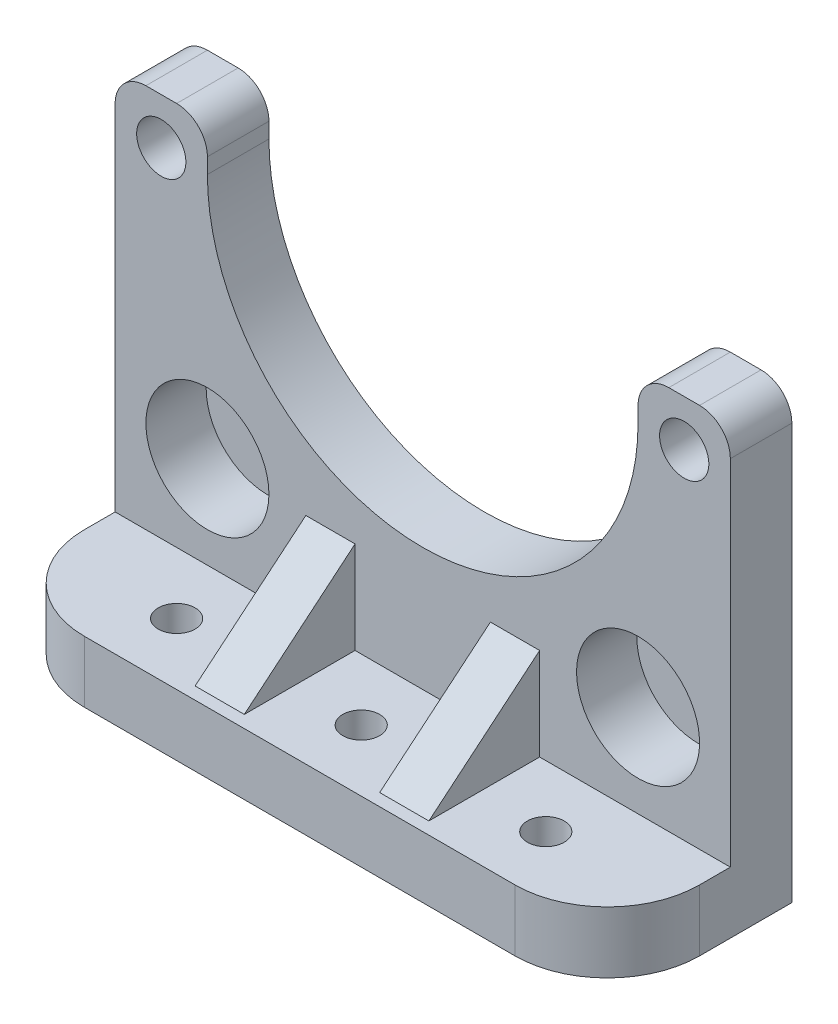
ISO-10303-21;
HEADER;
FILE_DESCRIPTION(('STEP AP214'),'2;1');
FILE_NAME('part.step','',(''),(''),'','','');
FILE_SCHEMA(('AUTOMOTIVE_DESIGN { 1 0 10303 214 1 1 1 1 }'));
ENDSEC;
DATA;
#1=APPLICATION_CONTEXT('core data for automotive mechanical design processes');
#2=APPLICATION_PROTOCOL_DEFINITION('international standard','automotive_design',2000,#1);
#3=PRODUCT_CONTEXT('',#1,'mechanical');
#4=PRODUCT('Part','Part','',(#3));
#5=PRODUCT_RELATED_PRODUCT_CATEGORY('part','',(#4));
#6=PRODUCT_DEFINITION_FORMATION('','',#4);
#7=PRODUCT_DEFINITION_CONTEXT('part definition',#1,'design');
#8=PRODUCT_DEFINITION('design','',#6,#7);
#9=PRODUCT_DEFINITION_SHAPE('','',#8);
#10=(LENGTH_UNIT() NAMED_UNIT(*) SI_UNIT(.MILLI.,.METRE.));
#11=(NAMED_UNIT(*) PLANE_ANGLE_UNIT() SI_UNIT($,.RADIAN.));
#12=(NAMED_UNIT(*) SI_UNIT($,.STERADIAN.) SOLID_ANGLE_UNIT());
#13=UNCERTAINTY_MEASURE_WITH_UNIT(LENGTH_MEASURE(1.E-05),#10,'distance_accuracy_value','');
#14=(GEOMETRIC_REPRESENTATION_CONTEXT(3) GLOBAL_UNCERTAINTY_ASSIGNED_CONTEXT((#13)) GLOBAL_UNIT_ASSIGNED_CONTEXT((#10,
#11,#12)) REPRESENTATION_CONTEXT('',''));
#15=CARTESIAN_POINT('',(0.,0.,0.));
#16=DIRECTION('',(0.,0.,1.));
#17=DIRECTION('',(1.,0.,0.));
#18=AXIS2_PLACEMENT_3D('',#15,#16,#17);
#19=CARTESIAN_POINT('',(0.,0.,10.));
#20=DIRECTION('',(0.,0.,-1.));
#21=DIRECTION('',(-1.,0.,0.));
#22=AXIS2_PLACEMENT_3D('',#19,#20,#21);
#23=PLANE('',#22);
#24=CARTESIAN_POINT('',(85.,25.,10.));
#25=DIRECTION('',(0.,0.,1.));
#26=DIRECTION('',(-1.,0.,0.));
#27=AXIS2_PLACEMENT_3D('',#24,#25,#26);
#28=CIRCLE('',#27,10.);
#29=CARTESIAN_POINT('',(75.,25.,10.));
#30=VERTEX_POINT('',#29);
#31=EDGE_CURVE('E535',#30,#30,#28,.T.);
#32=ORIENTED_EDGE('',*,*,#31,.F.);
#33=EDGE_LOOP('',(#32));
#34=FACE_BOUND('',#33,.T.);
#35=CARTESIAN_POINT('',(15.,25.,10.));
#36=DIRECTION('',(0.,0.,1.));
#37=DIRECTION('',(1.,0.,0.));
#38=AXIS2_PLACEMENT_3D('',#35,#36,#37);
#39=CIRCLE('',#38,10.);
#40=CARTESIAN_POINT('',(25.,25.,10.));
#41=VERTEX_POINT('',#40);
#42=EDGE_CURVE('E539',#41,#41,#39,.T.);
#43=ORIENTED_EDGE('',*,*,#42,.F.);
#44=EDGE_LOOP('',(#43));
#45=FACE_BOUND('',#44,.T.);
#46=CARTESIAN_POINT('',(92.5,65.,10.));
#47=DIRECTION('',(0.,0.,1.));
#48=DIRECTION('',(-1.,0.,0.));
#49=AXIS2_PLACEMENT_3D('',#46,#47,#48);
#50=CIRCLE('',#49,4.00000000000002);
#51=CARTESIAN_POINT('',(88.5,65.,10.));
#52=VERTEX_POINT('',#51);
#53=EDGE_CURVE('E548',#52,#52,#50,.T.);
#54=ORIENTED_EDGE('',*,*,#53,.F.);
#55=EDGE_LOOP('',(#54));
#56=FACE_BOUND('',#55,.T.);
#57=CARTESIAN_POINT('',(7.49999999999997,65.,10.));
#58=DIRECTION('',(0.,0.,1.));
#59=DIRECTION('',(1.,0.,0.));
#60=AXIS2_PLACEMENT_3D('',#57,#58,#59);
#61=CIRCLE('',#60,4.);
#62=CARTESIAN_POINT('',(11.5,65.,10.));
#63=VERTEX_POINT('',#62);
#64=EDGE_CURVE('E554',#63,#63,#61,.T.);
#65=ORIENTED_EDGE('',*,*,#64,.F.);
#66=EDGE_LOOP('',(#65));
#67=FACE_BOUND('',#66,.T.);
#68=DIRECTION('',(-1.,0.,0.));
#69=VECTOR('',#68,1.);
#70=CARTESIAN_POINT('',(0.,72.5,10.));
#71=LINE('',#70,#69);
#72=CARTESIAN_POINT('',(9.99999999999998,72.5,10.));
#73=VERTEX_POINT('',#72);
#74=CARTESIAN_POINT('',(4.99999999999997,72.5,10.));
#75=VERTEX_POINT('',#74);
#76=EDGE_CURVE('E282',#73,#75,#71,.T.);
#77=ORIENTED_EDGE('',*,*,#76,.T.);
#78=CARTESIAN_POINT('',(4.99999999999997,67.5,10.));
#79=DIRECTION('',(0.,0.,-1.));
#80=DIRECTION('',(-1.,0.,0.));
#81=AXIS2_PLACEMENT_3D('',#78,#79,#80);
#82=CIRCLE('',#81,5.);
#83=CARTESIAN_POINT('',(0.,67.5,10.));
#84=VERTEX_POINT('',#83);
#85=EDGE_CURVE('E423',#75,#84,#82,.F.);
#86=ORIENTED_EDGE('',*,*,#85,.T.);
#87=DIRECTION('',(0.,-1.,0.));
#88=VECTOR('',#87,1.);
#89=CARTESIAN_POINT('',(0.,0.,10.));
#90=LINE('',#89,#88);
#91=CARTESIAN_POINT('',(0.,10.,10.));
#92=VERTEX_POINT('',#91);
#93=EDGE_CURVE('E264',#84,#92,#90,.T.);
#94=ORIENTED_EDGE('',*,*,#93,.T.);
#95=DIRECTION('',(-1.,0.,0.));
#96=VECTOR('',#95,1.);
#97=CARTESIAN_POINT('',(0.,10.,10.));
#98=LINE('',#97,#96);
#99=CARTESIAN_POINT('',(31.,10.,10.));
#100=VERTEX_POINT('',#99);
#101=EDGE_CURVE('E209',#100,#92,#98,.T.);
#102=ORIENTED_EDGE('',*,*,#101,.F.);
#103=DIRECTION('',(0.,-1.,0.));
#104=VECTOR('',#103,1.);
#105=CARTESIAN_POINT('',(31.,10.,10.));
#106=LINE('',#105,#104);
#107=CARTESIAN_POINT('',(31.,25.,10.));
#108=VERTEX_POINT('',#107);
#109=EDGE_CURVE('E200',#108,#100,#106,.T.);
#110=ORIENTED_EDGE('',*,*,#109,.F.);
#111=DIRECTION('',(-1.,0.,0.));
#112=VECTOR('',#111,1.);
#113=CARTESIAN_POINT('',(31.,25.,10.));
#114=LINE('',#113,#112);
#115=CARTESIAN_POINT('',(39.,25.,10.));
#116=VERTEX_POINT('',#115);
#117=EDGE_CURVE('E182',#116,#108,#114,.T.);
#118=ORIENTED_EDGE('',*,*,#117,.F.);
#119=DIRECTION('',(0.,1.,0.));
#120=VECTOR('',#119,1.);
#121=CARTESIAN_POINT('',(39.,10.,10.));
#122=LINE('',#121,#120);
#123=CARTESIAN_POINT('',(39.,10.,10.));
#124=VERTEX_POINT('',#123);
#125=EDGE_CURVE('E194',#124,#116,#122,.T.);
#126=ORIENTED_EDGE('',*,*,#125,.F.);
#127=CARTESIAN_POINT('',(61.,10.,10.));
#128=VERTEX_POINT('',#127);
#129=EDGE_CURVE('E261',#128,#124,#98,.T.);
#130=ORIENTED_EDGE('',*,*,#129,.F.);
#131=DIRECTION('',(0.,-1.,0.));
#132=VECTOR('',#131,1.);
#133=CARTESIAN_POINT('',(61.,10.,10.));
#134=LINE('',#133,#132);
#135=CARTESIAN_POINT('',(61.,25.,10.));
#136=VERTEX_POINT('',#135);
#137=EDGE_CURVE('E570',#136,#128,#134,.T.);
#138=ORIENTED_EDGE('',*,*,#137,.F.);
#139=DIRECTION('',(-1.,0.,0.));
#140=VECTOR('',#139,1.);
#141=CARTESIAN_POINT('',(69.,25.,10.));
#142=LINE('',#141,#140);
#143=CARTESIAN_POINT('',(69.,25.,10.));
#144=VERTEX_POINT('',#143);
#145=EDGE_CURVE('E568',#144,#136,#142,.T.);
#146=ORIENTED_EDGE('',*,*,#145,.F.);
#147=DIRECTION('',(0.,1.,0.));
#148=VECTOR('',#147,1.);
#149=CARTESIAN_POINT('',(69.,10.,10.));
#150=LINE('',#149,#148);
#151=CARTESIAN_POINT('',(69.,10.,10.));
#152=VERTEX_POINT('',#151);
#153=EDGE_CURVE('E564',#152,#144,#150,.T.);
#154=ORIENTED_EDGE('',*,*,#153,.F.);
#155=CARTESIAN_POINT('',(100.,10.,10.));
#156=VERTEX_POINT('',#155);
#157=EDGE_CURVE('E245',#156,#152,#98,.T.);
#158=ORIENTED_EDGE('',*,*,#157,.F.);
#159=DIRECTION('',(0.,1.,0.));
#160=VECTOR('',#159,1.);
#161=CARTESIAN_POINT('',(100.,0.,10.));
#162=LINE('',#161,#160);
#163=CARTESIAN_POINT('',(100.,67.5,10.));
#164=VERTEX_POINT('',#163);
#165=EDGE_CURVE('E267',#156,#164,#162,.T.);
#166=ORIENTED_EDGE('',*,*,#165,.T.);
#167=CARTESIAN_POINT('',(95.,67.5,10.));
#168=DIRECTION('',(0.,0.,-1.));
#169=DIRECTION('',(-1.,0.,0.));
#170=AXIS2_PLACEMENT_3D('',#167,#168,#169);
#171=CIRCLE('',#170,5.);
#172=CARTESIAN_POINT('',(95.,72.5,10.));
#173=VERTEX_POINT('',#172);
#174=EDGE_CURVE('E412',#164,#173,#171,.F.);
#175=ORIENTED_EDGE('',*,*,#174,.T.);
#176=CARTESIAN_POINT('',(90.,72.5,10.));
#177=VERTEX_POINT('',#176);
#178=EDGE_CURVE('E278',#173,#177,#71,.T.);
#179=ORIENTED_EDGE('',*,*,#178,.T.);
#180=CARTESIAN_POINT('',(90.,67.5,10.));
#181=DIRECTION('',(0.,0.,-1.));
#182=DIRECTION('',(-1.,0.,0.));
#183=AXIS2_PLACEMENT_3D('',#180,#181,#182);
#184=CIRCLE('',#183,5.);
#185=CARTESIAN_POINT('',(85.,67.5,10.));
#186=VERTEX_POINT('',#185);
#187=EDGE_CURVE('E427',#177,#186,#184,.F.);
#188=ORIENTED_EDGE('',*,*,#187,.T.);
#189=DIRECTION('',(0.,1.,0.));
#190=VECTOR('',#189,1.);
#191=CARTESIAN_POINT('',(85.,65.,10.));
#192=LINE('',#191,#190);
#193=CARTESIAN_POINT('',(85.,65.,10.));
#194=VERTEX_POINT('',#193);
#195=EDGE_CURVE('E319',#194,#186,#192,.T.);
#196=ORIENTED_EDGE('',*,*,#195,.F.);
#197=CARTESIAN_POINT('',(50.,65.,10.));
#198=DIRECTION('',(0.,0.,1.));
#199=DIRECTION('',(1.,0.,0.));
#200=AXIS2_PLACEMENT_3D('',#197,#198,#199);
#201=CIRCLE('',#200,35.);
#202=CARTESIAN_POINT('',(15.,65.,10.));
#203=VERTEX_POINT('',#202);
#204=EDGE_CURVE('E324',#203,#194,#201,.T.);
#205=ORIENTED_EDGE('',*,*,#204,.F.);
#206=DIRECTION('',(0.,-1.,0.));
#207=VECTOR('',#206,1.);
#208=CARTESIAN_POINT('',(15.,65.,10.));
#209=LINE('',#208,#207);
#210=CARTESIAN_POINT('',(15.,67.5,10.));
#211=VERTEX_POINT('',#210);
#212=EDGE_CURVE('E251',#211,#203,#209,.T.);
#213=ORIENTED_EDGE('',*,*,#212,.F.);
#214=CARTESIAN_POINT('',(9.99999999999998,67.5,9.99999999999999));
#215=DIRECTION('',(0.,0.,-1.));
#216=DIRECTION('',(-1.,0.,0.));
#217=AXIS2_PLACEMENT_3D('',#214,#215,#216);
#218=CIRCLE('',#217,5.);
#219=EDGE_CURVE('E425',#211,#73,#218,.F.);
#220=ORIENTED_EDGE('',*,*,#219,.T.);
#221=EDGE_LOOP('',(#77,#86,#94,#102,#110,#118,#126,#130,#138,#146,#154,#158,#166,#175,#179,#188,
#196,#205,#213,#220));
#222=FACE_BOUND('',#221,.T.);
#223=ADVANCED_FACE('F34',(#34,#45,#56,#67,#222),#23,.F.);
#224=CARTESIAN_POINT('',(0.,10.,30.));
#225=DIRECTION('',(0.,-1.,0.));
#226=DIRECTION('',(0.,0.,-1.));
#227=AXIS2_PLACEMENT_3D('',#224,#225,#226);
#228=PLANE('',#227);
#229=CARTESIAN_POINT('',(80.,10.,20.));
#230=DIRECTION('',(0.,-1.,0.));
#231=DIRECTION('',(0.,0.,-1.));
#232=AXIS2_PLACEMENT_3D('',#229,#230,#231);
#233=CIRCLE('',#232,2.99999999999999);
#234=CARTESIAN_POINT('',(80.,10.,17.));
#235=VERTEX_POINT('',#234);
#236=EDGE_CURVE('E232',#235,#235,#233,.F.);
#237=ORIENTED_EDGE('',*,*,#236,.F.);
#238=EDGE_LOOP('',(#237));
#239=FACE_BOUND('',#238,.T.);
#240=DIRECTION('',(0.,0.,-1.));
#241=VECTOR('',#240,1.);
#242=CARTESIAN_POINT('',(0.,10.,30.));
#243=LINE('',#242,#241);
#244=CARTESIAN_POINT('',(0.,10.,15.));
#245=VERTEX_POINT('',#244);
#246=EDGE_CURVE('E248',#245,#92,#243,.T.);
#247=ORIENTED_EDGE('',*,*,#246,.F.);
#248=CARTESIAN_POINT('',(15.,10.,15.));
#249=DIRECTION('',(0.,-1.,0.));
#250=DIRECTION('',(0.,0.,-1.));
#251=AXIS2_PLACEMENT_3D('',#248,#249,#250);
#252=CIRCLE('',#251,15.);
#253=CARTESIAN_POINT('',(15.,10.,30.));
#254=VERTEX_POINT('',#253);
#255=EDGE_CURVE('E42',#245,#254,#252,.F.);
#256=ORIENTED_EDGE('',*,*,#255,.T.);
#257=DIRECTION('',(-1.,0.,0.));
#258=VECTOR('',#257,1.);
#259=CARTESIAN_POINT('',(0.,10.,30.));
#260=LINE('',#259,#258);
#261=CARTESIAN_POINT('',(85.,10.,30.));
#262=VERTEX_POINT('',#261);
#263=EDGE_CURVE('E244',#262,#254,#260,.T.);
#264=ORIENTED_EDGE('',*,*,#263,.F.);
#265=CARTESIAN_POINT('',(85.,10.,15.));
#266=DIRECTION('',(0.,-1.,0.));
#267=DIRECTION('',(0.,0.,-1.));
#268=AXIS2_PLACEMENT_3D('',#265,#266,#267);
#269=CIRCLE('',#268,15.);
#270=CARTESIAN_POINT('',(100.,10.,15.));
#271=VERTEX_POINT('',#270);
#272=EDGE_CURVE('E49',#262,#271,#269,.F.);
#273=ORIENTED_EDGE('',*,*,#272,.T.);
#274=DIRECTION('',(0.,0.,-1.));
#275=VECTOR('',#274,1.);
#276=CARTESIAN_POINT('',(100.,10.,30.));
#277=LINE('',#276,#275);
#278=EDGE_CURVE('E327',#271,#156,#277,.T.);
#279=ORIENTED_EDGE('',*,*,#278,.T.);
#280=ORIENTED_EDGE('',*,*,#157,.T.);
#281=DIRECTION('',(0.,0.,-1.));
#282=VECTOR('',#281,1.);
#283=CARTESIAN_POINT('',(69.,10.,47.));
#284=LINE('',#283,#282);
#285=CARTESIAN_POINT('',(69.,10.,28.));
#286=VERTEX_POINT('',#285);
#287=EDGE_CURVE('E214',#286,#152,#284,.T.);
#288=ORIENTED_EDGE('',*,*,#287,.F.);
#289=DIRECTION('',(-1.,0.,0.));
#290=VECTOR('',#289,1.);
#291=CARTESIAN_POINT('',(69.,10.,28.));
#292=LINE('',#291,#290);
#293=CARTESIAN_POINT('',(61.,10.,28.));
#294=VERTEX_POINT('',#293);
#295=EDGE_CURVE('E210',#286,#294,#292,.T.);
#296=ORIENTED_EDGE('',*,*,#295,.T.);
#297=DIRECTION('',(0.,0.,-1.));
#298=VECTOR('',#297,1.);
#299=CARTESIAN_POINT('',(61.,10.,47.));
#300=LINE('',#299,#298);
#301=EDGE_CURVE('E573',#294,#128,#300,.T.);
#302=ORIENTED_EDGE('',*,*,#301,.T.);
#303=ORIENTED_EDGE('',*,*,#129,.T.);
#304=DIRECTION('',(0.,0.,-1.));
#305=VECTOR('',#304,1.);
#306=CARTESIAN_POINT('',(39.,10.,47.));
#307=LINE('',#306,#305);
#308=CARTESIAN_POINT('',(39.,10.,28.));
#309=VERTEX_POINT('',#308);
#310=EDGE_CURVE('E193',#309,#124,#307,.T.);
#311=ORIENTED_EDGE('',*,*,#310,.F.);
#312=DIRECTION('',(-1.,0.,0.));
#313=VECTOR('',#312,1.);
#314=CARTESIAN_POINT('',(31.,10.,28.));
#315=LINE('',#314,#313);
#316=CARTESIAN_POINT('',(31.,10.,28.));
#317=VERTEX_POINT('',#316);
#318=EDGE_CURVE('E217',#309,#317,#315,.T.);
#319=ORIENTED_EDGE('',*,*,#318,.T.);
#320=DIRECTION('',(0.,0.,-1.));
#321=VECTOR('',#320,1.);
#322=CARTESIAN_POINT('',(31.,10.,47.));
#323=LINE('',#322,#321);
#324=EDGE_CURVE('E201',#317,#100,#323,.T.);
#325=ORIENTED_EDGE('',*,*,#324,.T.);
#326=ORIENTED_EDGE('',*,*,#101,.T.);
#327=EDGE_LOOP('',(#247,#256,#264,#273,#279,#280,#288,#296,#302,#303,#311,#319,#325,#326));
#328=FACE_BOUND('',#327,.T.);
#329=CARTESIAN_POINT('',(20.,10.,20.));
#330=DIRECTION('',(0.,-1.,0.));
#331=DIRECTION('',(0.,0.,-1.));
#332=AXIS2_PLACEMENT_3D('',#329,#330,#331);
#333=CIRCLE('',#332,2.99999999999999);
#334=CARTESIAN_POINT('',(20.,10.,17.));
#335=VERTEX_POINT('',#334);
#336=EDGE_CURVE('E238',#335,#335,#333,.F.);
#337=ORIENTED_EDGE('',*,*,#336,.F.);
#338=EDGE_LOOP('',(#337));
#339=FACE_BOUND('',#338,.T.);
#340=CARTESIAN_POINT('',(50.,10.,20.));
#341=DIRECTION('',(0.,-1.,0.));
#342=DIRECTION('',(0.,0.,-1.));
#343=AXIS2_PLACEMENT_3D('',#340,#341,#342);
#344=CIRCLE('',#343,3.00000000000001);
#345=CARTESIAN_POINT('',(50.,10.,17.));
#346=VERTEX_POINT('',#345);
#347=EDGE_CURVE('E226',#346,#346,#344,.F.);
#348=ORIENTED_EDGE('',*,*,#347,.F.);
#349=EDGE_LOOP('',(#348));
#350=FACE_BOUND('',#349,.T.);
#351=ADVANCED_FACE('F337',(#239,#328,#339,#350),#228,.F.);
#352=CARTESIAN_POINT('',(0.,72.5,10.));
#353=DIRECTION('',(0.,-1.,0.));
#354=DIRECTION('',(0.,0.,-1.));
#355=AXIS2_PLACEMENT_3D('',#352,#353,#354);
#356=PLANE('',#355);
#357=DIRECTION('',(-1.,0.,0.));
#358=VECTOR('',#357,1.);
#359=CARTESIAN_POINT('',(0.,72.5,0.));
#360=LINE('',#359,#358);
#361=CARTESIAN_POINT('',(95.,72.5,0.));
#362=VERTEX_POINT('',#361);
#363=CARTESIAN_POINT('',(90.,72.5,0.));
#364=VERTEX_POINT('',#363);
#365=EDGE_CURVE('E268',#362,#364,#360,.T.);
#366=ORIENTED_EDGE('',*,*,#365,.T.);
#367=DIRECTION('',(0.,0.,1.));
#368=VECTOR('',#367,1.);
#369=CARTESIAN_POINT('',(90.,72.5,10.));
#370=LINE('',#369,#368);
#371=EDGE_CURVE('E414',#364,#177,#370,.T.);
#372=ORIENTED_EDGE('',*,*,#371,.T.);
#373=ORIENTED_EDGE('',*,*,#178,.F.);
#374=DIRECTION('',(0.,0.,-1.));
#375=VECTOR('',#374,1.);
#376=CARTESIAN_POINT('',(95.,72.5,10.));
#377=LINE('',#376,#375);
#378=EDGE_CURVE('E419',#173,#362,#377,.T.);
#379=ORIENTED_EDGE('',*,*,#378,.T.);
#380=EDGE_LOOP('',(#366,#372,#373,#379));
#381=FACE_BOUND('',#380,.T.);
#382=ADVANCED_FACE('F363',(#381),#356,.F.);
#383=CARTESIAN_POINT('',(0.,0.,10.));
#384=DIRECTION('',(1.,0.,0.));
#385=DIRECTION('',(0.,1.,0.));
#386=AXIS2_PLACEMENT_3D('',#383,#384,#385);
#387=PLANE('',#386);
#388=DIRECTION('',(0.,0.,-1.));
#389=VECTOR('',#388,1.);
#390=CARTESIAN_POINT('',(0.,0.,10.));
#391=LINE('',#390,#389);
#392=CARTESIAN_POINT('',(0.,0.,15.));
#393=VERTEX_POINT('',#392);
#394=CARTESIAN_POINT('',(0.,0.,0.));
#395=VERTEX_POINT('',#394);
#396=EDGE_CURVE('E283',#393,#395,#391,.T.);
#397=ORIENTED_EDGE('',*,*,#396,.F.);
#398=DIRECTION('',(0.,-1.,0.));
#399=VECTOR('',#398,1.);
#400=CARTESIAN_POINT('',(0.,0.,15.));
#401=LINE('',#400,#399);
#402=EDGE_CURVE('E57',#393,#245,#401,.F.);
#403=ORIENTED_EDGE('',*,*,#402,.T.);
#404=ORIENTED_EDGE('',*,*,#246,.T.);
#405=ORIENTED_EDGE('',*,*,#93,.F.);
#406=DIRECTION('',(0.,0.,-1.));
#407=VECTOR('',#406,1.);
#408=CARTESIAN_POINT('',(0.,67.5,10.));
#409=LINE('',#408,#407);
#410=CARTESIAN_POINT('',(0.,67.5,0.));
#411=VERTEX_POINT('',#410);
#412=EDGE_CURVE('E269',#84,#411,#409,.T.);
#413=ORIENTED_EDGE('',*,*,#412,.T.);
#414=DIRECTION('',(0.,-1.,0.));
#415=VECTOR('',#414,1.);
#416=CARTESIAN_POINT('',(0.,0.,0.));
#417=LINE('',#416,#415);
#418=EDGE_CURVE('E295',#411,#395,#417,.T.);
#419=ORIENTED_EDGE('',*,*,#418,.T.);
#420=EDGE_LOOP('',(#397,#403,#404,#405,#413,#419));
#421=FACE_BOUND('',#420,.T.);
#422=ADVANCED_FACE('F361',(#421),#387,.F.);
#423=CARTESIAN_POINT('',(0.,0.,10.));
#424=DIRECTION('',(0.,1.,0.));
#425=DIRECTION('',(0.,0.,1.));
#426=AXIS2_PLACEMENT_3D('',#423,#424,#425);
#427=PLANE('',#426);
#428=CARTESIAN_POINT('',(50.,0.,20.));
#429=DIRECTION('',(0.,-1.,0.));
#430=DIRECTION('',(0.,0.,-1.));
#431=AXIS2_PLACEMENT_3D('',#428,#429,#430);
#432=CIRCLE('',#431,3.00000000000001);
#433=CARTESIAN_POINT('',(50.,0.,17.));
#434=VERTEX_POINT('',#433);
#435=EDGE_CURVE('E223',#434,#434,#432,.T.);
#436=ORIENTED_EDGE('',*,*,#435,.F.);
#437=EDGE_LOOP('',(#436));
#438=FACE_BOUND('',#437,.T.);
#439=CARTESIAN_POINT('',(80.,0.,20.));
#440=DIRECTION('',(0.,-1.,0.));
#441=DIRECTION('',(0.,0.,-1.));
#442=AXIS2_PLACEMENT_3D('',#439,#440,#441);
#443=CIRCLE('',#442,2.99999999999999);
#444=CARTESIAN_POINT('',(80.,0.,17.));
#445=VERTEX_POINT('',#444);
#446=EDGE_CURVE('E229',#445,#445,#443,.T.);
#447=ORIENTED_EDGE('',*,*,#446,.F.);
#448=EDGE_LOOP('',(#447));
#449=FACE_BOUND('',#448,.T.);
#450=CARTESIAN_POINT('',(20.,0.,20.));
#451=DIRECTION('',(0.,-1.,0.));
#452=DIRECTION('',(0.,0.,-1.));
#453=AXIS2_PLACEMENT_3D('',#450,#451,#452);
#454=CIRCLE('',#453,2.99999999999999);
#455=CARTESIAN_POINT('',(20.,0.,17.));
#456=VERTEX_POINT('',#455);
#457=EDGE_CURVE('E235',#456,#456,#454,.T.);
#458=ORIENTED_EDGE('',*,*,#457,.F.);
#459=EDGE_LOOP('',(#458));
#460=FACE_BOUND('',#459,.T.);
#461=DIRECTION('',(1.,0.,0.));
#462=VECTOR('',#461,1.);
#463=CARTESIAN_POINT('',(0.,0.,30.));
#464=LINE('',#463,#462);
#465=CARTESIAN_POINT('',(15.,0.,30.));
#466=VERTEX_POINT('',#465);
#467=CARTESIAN_POINT('',(85.,0.,30.));
#468=VERTEX_POINT('',#467);
#469=EDGE_CURVE('E241',#466,#468,#464,.T.);
#470=ORIENTED_EDGE('',*,*,#469,.F.);
#471=CARTESIAN_POINT('',(15.,0.,15.));
#472=DIRECTION('',(0.,1.,0.));
#473=DIRECTION('',(0.,0.,1.));
#474=AXIS2_PLACEMENT_3D('',#471,#472,#473);
#475=CIRCLE('',#474,15.);
#476=EDGE_CURVE('E350',#466,#393,#475,.F.);
#477=ORIENTED_EDGE('',*,*,#476,.T.);
#478=ORIENTED_EDGE('',*,*,#396,.T.);
#479=DIRECTION('',(1.,0.,0.));
#480=VECTOR('',#479,1.);
#481=CARTESIAN_POINT('',(0.,0.,0.));
#482=LINE('',#481,#480);
#483=CARTESIAN_POINT('',(100.,0.,0.));
#484=VERTEX_POINT('',#483);
#485=EDGE_CURVE('E293',#395,#484,#482,.T.);
#486=ORIENTED_EDGE('',*,*,#485,.T.);
#487=DIRECTION('',(0.,0.,-1.));
#488=VECTOR('',#487,1.);
#489=CARTESIAN_POINT('',(100.,0.,10.));
#490=LINE('',#489,#488);
#491=CARTESIAN_POINT('',(100.,0.,15.));
#492=VERTEX_POINT('',#491);
#493=EDGE_CURVE('E285',#492,#484,#490,.T.);
#494=ORIENTED_EDGE('',*,*,#493,.F.);
#495=CARTESIAN_POINT('',(85.,0.,15.));
#496=DIRECTION('',(0.,1.,0.));
#497=DIRECTION('',(0.,0.,1.));
#498=AXIS2_PLACEMENT_3D('',#495,#496,#497);
#499=CIRCLE('',#498,15.);
#500=EDGE_CURVE('E351',#492,#468,#499,.F.);
#501=ORIENTED_EDGE('',*,*,#500,.T.);
#502=EDGE_LOOP('',(#470,#477,#478,#486,#494,#501));
#503=FACE_BOUND('',#502,.T.);
#504=ADVANCED_FACE('F360',(#438,#449,#460,#503),#427,.F.);
#505=CARTESIAN_POINT('',(100.,0.,10.));
#506=DIRECTION('',(-1.,0.,0.));
#507=DIRECTION('',(0.,-1.,0.));
#508=AXIS2_PLACEMENT_3D('',#505,#506,#507);
#509=PLANE('',#508);
#510=ORIENTED_EDGE('',*,*,#278,.F.);
#511=DIRECTION('',(0.,1.,0.));
#512=VECTOR('',#511,1.);
#513=CARTESIAN_POINT('',(100.,0.,15.));
#514=LINE('',#513,#512);
#515=EDGE_CURVE('E12',#271,#492,#514,.F.);
#516=ORIENTED_EDGE('',*,*,#515,.T.);
#517=ORIENTED_EDGE('',*,*,#493,.T.);
#518=DIRECTION('',(0.,1.,0.));
#519=VECTOR('',#518,1.);
#520=CARTESIAN_POINT('',(100.,0.,0.));
#521=LINE('',#520,#519);
#522=CARTESIAN_POINT('',(100.,67.5,0.));
#523=VERTEX_POINT('',#522);
#524=EDGE_CURVE('E290',#484,#523,#521,.T.);
#525=ORIENTED_EDGE('',*,*,#524,.T.);
#526=DIRECTION('',(0.,0.,-1.));
#527=VECTOR('',#526,1.);
#528=CARTESIAN_POINT('',(100.,67.5,10.));
#529=LINE('',#528,#527);
#530=EDGE_CURVE('E354',#523,#164,#529,.F.);
#531=ORIENTED_EDGE('',*,*,#530,.T.);
#532=ORIENTED_EDGE('',*,*,#165,.F.);
#533=EDGE_LOOP('',(#510,#516,#517,#525,#531,#532));
#534=FACE_BOUND('',#533,.T.);
#535=ADVANCED_FACE('F369',(#534),#509,.F.);
#536=CARTESIAN_POINT('',(9.99999999999998,72.5,0.));
#537=VERTEX_POINT('',#536);
#538=CARTESIAN_POINT('',(4.99999999999997,72.5,0.));
#539=VERTEX_POINT('',#538);
#540=EDGE_CURVE('E287',#537,#539,#360,.T.);
#541=ORIENTED_EDGE('',*,*,#540,.T.);
#542=DIRECTION('',(0.,0.,-1.));
#543=VECTOR('',#542,1.);
#544=CARTESIAN_POINT('',(4.99999999999997,72.5,10.));
#545=LINE('',#544,#543);
#546=EDGE_CURVE('E430',#539,#75,#545,.F.);
#547=ORIENTED_EDGE('',*,*,#546,.T.);
#548=ORIENTED_EDGE('',*,*,#76,.F.);
#549=DIRECTION('',(0.,0.,1.));
#550=VECTOR('',#549,1.);
#551=CARTESIAN_POINT('',(9.99999999999998,72.5,10.));
#552=LINE('',#551,#550);
#553=EDGE_CURVE('E432',#73,#537,#552,.F.);
#554=ORIENTED_EDGE('',*,*,#553,.T.);
#555=EDGE_LOOP('',(#541,#547,#548,#554));
#556=FACE_BOUND('',#555,.T.);
#557=ADVANCED_FACE('F374',(#556),#356,.F.);
#558=CARTESIAN_POINT('',(0.,0.,0.));
#559=DIRECTION('',(0.,0.,-1.));
#560=DIRECTION('',(-1.,0.,0.));
#561=AXIS2_PLACEMENT_3D('',#558,#559,#560);
#562=PLANE('',#561);
#563=ORIENTED_EDGE('',*,*,#418,.F.);
#564=CARTESIAN_POINT('',(4.99999999999997,67.5,0.));
#565=DIRECTION('',(0.,0.,-1.));
#566=DIRECTION('',(-1.,0.,0.));
#567=AXIS2_PLACEMENT_3D('',#564,#565,#566);
#568=CIRCLE('',#567,5.);
#569=EDGE_CURVE('E434',#411,#539,#568,.T.);
#570=ORIENTED_EDGE('',*,*,#569,.T.);
#571=ORIENTED_EDGE('',*,*,#540,.F.);
#572=CARTESIAN_POINT('',(9.99999999999998,67.5,0.));
#573=DIRECTION('',(0.,0.,-1.));
#574=DIRECTION('',(-1.,0.,0.));
#575=AXIS2_PLACEMENT_3D('',#572,#573,#574);
#576=CIRCLE('',#575,5.);
#577=CARTESIAN_POINT('',(15.,67.5,0.));
#578=VERTEX_POINT('',#577);
#579=EDGE_CURVE('E436',#537,#578,#576,.T.);
#580=ORIENTED_EDGE('',*,*,#579,.T.);
#581=DIRECTION('',(0.,-1.,0.));
#582=VECTOR('',#581,1.);
#583=CARTESIAN_POINT('',(15.,65.,0.));
#584=LINE('',#583,#582);
#585=CARTESIAN_POINT('',(15.,65.,0.));
#586=VERTEX_POINT('',#585);
#587=EDGE_CURVE('E312',#578,#586,#584,.T.);
#588=ORIENTED_EDGE('',*,*,#587,.T.);
#589=CARTESIAN_POINT('',(50.,65.,0.));
#590=DIRECTION('',(0.,0.,-1.));
#591=DIRECTION('',(-1.,0.,0.));
#592=AXIS2_PLACEMENT_3D('',#589,#590,#591);
#593=CIRCLE('',#592,35.);
#594=CARTESIAN_POINT('',(85.,65.,0.));
#595=VERTEX_POINT('',#594);
#596=EDGE_CURVE('E300',#586,#595,#593,.F.);
#597=ORIENTED_EDGE('',*,*,#596,.T.);
#598=DIRECTION('',(0.,1.,0.));
#599=VECTOR('',#598,1.);
#600=CARTESIAN_POINT('',(85.,65.,0.));
#601=LINE('',#600,#599);
#602=CARTESIAN_POINT('',(85.,67.5,0.));
#603=VERTEX_POINT('',#602);
#604=EDGE_CURVE('E315',#595,#603,#601,.T.);
#605=ORIENTED_EDGE('',*,*,#604,.T.);
#606=CARTESIAN_POINT('',(90.,67.5,0.));
#607=DIRECTION('',(0.,0.,-1.));
#608=DIRECTION('',(-1.,0.,0.));
#609=AXIS2_PLACEMENT_3D('',#606,#607,#608);
#610=CIRCLE('',#609,5.);
#611=EDGE_CURVE('E438',#603,#364,#610,.T.);
#612=ORIENTED_EDGE('',*,*,#611,.T.);
#613=ORIENTED_EDGE('',*,*,#365,.F.);
#614=CARTESIAN_POINT('',(95.,67.5,0.));
#615=DIRECTION('',(0.,0.,-1.));
#616=DIRECTION('',(-1.,0.,0.));
#617=AXIS2_PLACEMENT_3D('',#614,#615,#616);
#618=CIRCLE('',#617,5.);
#619=EDGE_CURVE('E410',#362,#523,#618,.T.);
#620=ORIENTED_EDGE('',*,*,#619,.T.);
#621=ORIENTED_EDGE('',*,*,#524,.F.);
#622=ORIENTED_EDGE('',*,*,#485,.F.);
#623=EDGE_LOOP('',(#563,#570,#571,#580,#588,#597,#605,#612,#613,#620,#621,#622));
#624=FACE_BOUND('',#623,.T.);
#625=ADVANCED_FACE('F390',(#624),#562,.T.);
#626=CARTESIAN_POINT('',(85.,65.,-81.891696770796));
#627=DIRECTION('',(1.,0.,0.));
#628=DIRECTION('',(0.,0.,-1.));
#629=AXIS2_PLACEMENT_3D('',#626,#627,#628);
#630=PLANE('',#629);
#631=ORIENTED_EDGE('',*,*,#195,.T.);
#632=DIRECTION('',(0.,0.,1.));
#633=VECTOR('',#632,1.);
#634=CARTESIAN_POINT('',(85.,67.5,-81.891696770796));
#635=LINE('',#634,#633);
#636=EDGE_CURVE('E413',#186,#603,#635,.F.);
#637=ORIENTED_EDGE('',*,*,#636,.T.);
#638=ORIENTED_EDGE('',*,*,#604,.F.);
#639=DIRECTION('',(0.,0.,1.));
#640=VECTOR('',#639,1.);
#641=CARTESIAN_POINT('',(85.,65.,-81.891696770796));
#642=LINE('',#641,#640);
#643=EDGE_CURVE('E274',#595,#194,#642,.T.);
#644=ORIENTED_EDGE('',*,*,#643,.T.);
#645=EDGE_LOOP('',(#631,#637,#638,#644));
#646=FACE_BOUND('',#645,.T.);
#647=ADVANCED_FACE('F388',(#646),#630,.F.);
#648=CARTESIAN_POINT('',(15.,65.,-81.891696770796));
#649=DIRECTION('',(-1.,0.,0.));
#650=DIRECTION('',(0.,0.,1.));
#651=AXIS2_PLACEMENT_3D('',#648,#649,#650);
#652=PLANE('',#651);
#653=ORIENTED_EDGE('',*,*,#587,.F.);
#654=DIRECTION('',(0.,0.,1.));
#655=VECTOR('',#654,1.);
#656=CARTESIAN_POINT('',(15.,67.5,-81.891696770796));
#657=LINE('',#656,#655);
#658=EDGE_CURVE('E421',#578,#211,#657,.T.);
#659=ORIENTED_EDGE('',*,*,#658,.T.);
#660=ORIENTED_EDGE('',*,*,#212,.T.);
#661=DIRECTION('',(0.,0.,1.));
#662=VECTOR('',#661,1.);
#663=CARTESIAN_POINT('',(15.,65.,-81.891696770796));
#664=LINE('',#663,#662);
#665=EDGE_CURVE('E306',#586,#203,#664,.T.);
#666=ORIENTED_EDGE('',*,*,#665,.F.);
#667=EDGE_LOOP('',(#653,#659,#660,#666));
#668=FACE_BOUND('',#667,.T.);
#669=ADVANCED_FACE('F457',(#668),#652,.F.);
#670=CARTESIAN_POINT('',(50.,65.,-81.891696770796));
#671=DIRECTION('',(0.,0.,1.));
#672=DIRECTION('',(1.,0.,0.));
#673=AXIS2_PLACEMENT_3D('',#670,#671,#672);
#674=CYLINDRICAL_SURFACE('',#673,35.);
#675=ORIENTED_EDGE('',*,*,#665,.T.);
#676=ORIENTED_EDGE('',*,*,#204,.T.);
#677=ORIENTED_EDGE('',*,*,#643,.F.);
#678=ORIENTED_EDGE('',*,*,#596,.F.);
#679=EDGE_LOOP('',(#675,#676,#677,#678));
#680=FACE_BOUND('',#679,.T.);
#681=ADVANCED_FACE('F461',(#680),#674,.F.);
#682=CARTESIAN_POINT('',(0.,0.,30.));
#683=DIRECTION('',(0.,0.,-1.));
#684=DIRECTION('',(-1.,0.,0.));
#685=AXIS2_PLACEMENT_3D('',#682,#683,#684);
#686=PLANE('',#685);
#687=ORIENTED_EDGE('',*,*,#263,.T.);
#688=DIRECTION('',(0.,-1.,0.));
#689=VECTOR('',#688,1.);
#690=CARTESIAN_POINT('',(15.,0.,30.));
#691=LINE('',#690,#689);
#692=EDGE_CURVE('E345',#254,#466,#691,.T.);
#693=ORIENTED_EDGE('',*,*,#692,.T.);
#694=ORIENTED_EDGE('',*,*,#469,.T.);
#695=DIRECTION('',(0.,1.,0.));
#696=VECTOR('',#695,1.);
#697=CARTESIAN_POINT('',(85.,0.,30.));
#698=LINE('',#697,#696);
#699=EDGE_CURVE('E348',#468,#262,#698,.T.);
#700=ORIENTED_EDGE('',*,*,#699,.T.);
#701=EDGE_LOOP('',(#687,#693,#694,#700));
#702=FACE_BOUND('',#701,.T.);
#703=ADVANCED_FACE('F344',(#702),#686,.F.);
#704=CARTESIAN_POINT('',(20.,18.4852813742386,20.));
#705=DIRECTION('',(0.,-1.,0.));
#706=DIRECTION('',(0.,0.,-1.));
#707=AXIS2_PLACEMENT_3D('',#704,#705,#706);
#708=CYLINDRICAL_SURFACE('',#707,2.99999999999999);
#709=ORIENTED_EDGE('',*,*,#336,.T.);
#710=EDGE_LOOP('',(#709));
#711=FACE_BOUND('',#710,.T.);
#712=ORIENTED_EDGE('',*,*,#457,.T.);
#713=EDGE_LOOP('',(#712));
#714=FACE_BOUND('',#713,.T.);
#715=ADVANCED_FACE('F469',(#711,#714),#708,.F.);
#716=CARTESIAN_POINT('',(80.,18.4852813742386,20.));
#717=DIRECTION('',(0.,-1.,0.));
#718=DIRECTION('',(0.,0.,-1.));
#719=AXIS2_PLACEMENT_3D('',#716,#717,#718);
#720=CYLINDRICAL_SURFACE('',#719,2.99999999999999);
#721=ORIENTED_EDGE('',*,*,#236,.T.);
#722=EDGE_LOOP('',(#721));
#723=FACE_BOUND('',#722,.T.);
#724=ORIENTED_EDGE('',*,*,#446,.T.);
#725=EDGE_LOOP('',(#724));
#726=FACE_BOUND('',#725,.T.);
#727=ADVANCED_FACE('F472',(#723,#726),#720,.F.);
#728=CARTESIAN_POINT('',(50.,18.4852813742386,20.));
#729=DIRECTION('',(0.,-1.,0.));
#730=DIRECTION('',(0.,0.,-1.));
#731=AXIS2_PLACEMENT_3D('',#728,#729,#730);
#732=CYLINDRICAL_SURFACE('',#731,3.00000000000001);
#733=ORIENTED_EDGE('',*,*,#347,.T.);
#734=EDGE_LOOP('',(#733));
#735=FACE_BOUND('',#734,.T.);
#736=ORIENTED_EDGE('',*,*,#435,.T.);
#737=EDGE_LOOP('',(#736));
#738=FACE_BOUND('',#737,.T.);
#739=ADVANCED_FACE('F476',(#735,#738),#732,.F.);
#740=CARTESIAN_POINT('',(39.,10.,47.));
#741=DIRECTION('',(-1.,0.,0.));
#742=DIRECTION('',(0.,0.,1.));
#743=AXIS2_PLACEMENT_3D('',#740,#741,#742);
#744=PLANE('',#743);
#745=ORIENTED_EDGE('',*,*,#125,.T.);
#746=DIRECTION('',(0.,-0.64018439966448,0.768221279597376));
#747=VECTOR('',#746,1.);
#748=CARTESIAN_POINT('',(39.,0.65573770491803,39.2131147540984));
#749=LINE('',#748,#747);
#750=EDGE_CURVE('E188',#116,#309,#749,.T.);
#751=ORIENTED_EDGE('',*,*,#750,.T.);
#752=ORIENTED_EDGE('',*,*,#310,.T.);
#753=EDGE_LOOP('',(#745,#751,#752));
#754=FACE_BOUND('',#753,.T.);
#755=ADVANCED_FACE('F480',(#754),#744,.F.);
#756=CARTESIAN_POINT('',(31.,10.,47.));
#757=DIRECTION('',(1.,0.,0.));
#758=DIRECTION('',(0.,0.,-1.));
#759=AXIS2_PLACEMENT_3D('',#756,#757,#758);
#760=PLANE('',#759);
#761=ORIENTED_EDGE('',*,*,#324,.F.);
#762=DIRECTION('',(0.,-0.64018439966448,0.768221279597376));
#763=VECTOR('',#762,1.);
#764=CARTESIAN_POINT('',(31.,25.,10.));
#765=LINE('',#764,#763);
#766=EDGE_CURVE('E185',#108,#317,#765,.T.);
#767=ORIENTED_EDGE('',*,*,#766,.F.);
#768=ORIENTED_EDGE('',*,*,#109,.T.);
#769=EDGE_LOOP('',(#761,#767,#768));
#770=FACE_BOUND('',#769,.T.);
#771=ADVANCED_FACE('F199',(#770),#760,.F.);
#772=CARTESIAN_POINT('',(61.,10.,47.));
#773=DIRECTION('',(1.,0.,0.));
#774=DIRECTION('',(0.,0.,-1.));
#775=AXIS2_PLACEMENT_3D('',#772,#773,#774);
#776=PLANE('',#775);
#777=ORIENTED_EDGE('',*,*,#301,.F.);
#778=DIRECTION('',(0.,0.64018439966448,-0.768221279597376));
#779=VECTOR('',#778,1.);
#780=CARTESIAN_POINT('',(61.,0.65573770491803,39.2131147540984));
#781=LINE('',#780,#779);
#782=EDGE_CURVE('E561',#294,#136,#781,.T.);
#783=ORIENTED_EDGE('',*,*,#782,.T.);
#784=ORIENTED_EDGE('',*,*,#137,.T.);
#785=EDGE_LOOP('',(#777,#783,#784));
#786=FACE_BOUND('',#785,.T.);
#787=ADVANCED_FACE('F484',(#786),#776,.F.);
#788=CARTESIAN_POINT('',(69.,10.,47.));
#789=DIRECTION('',(-1.,0.,0.));
#790=DIRECTION('',(0.,0.,1.));
#791=AXIS2_PLACEMENT_3D('',#788,#789,#790);
#792=PLANE('',#791);
#793=ORIENTED_EDGE('',*,*,#153,.T.);
#794=DIRECTION('',(0.,-0.64018439966448,0.768221279597376));
#795=VECTOR('',#794,1.);
#796=CARTESIAN_POINT('',(69.,0.65573770491803,39.2131147540984));
#797=LINE('',#796,#795);
#798=EDGE_CURVE('E202',#144,#286,#797,.T.);
#799=ORIENTED_EDGE('',*,*,#798,.T.);
#800=ORIENTED_EDGE('',*,*,#287,.T.);
#801=EDGE_LOOP('',(#793,#799,#800));
#802=FACE_BOUND('',#801,.T.);
#803=ADVANCED_FACE('F488',(#802),#792,.F.);
#804=CARTESIAN_POINT('',(100.00005,25.,10.));
#805=DIRECTION('',(0.,-0.768221279597376,-0.64018439966448));
#806=DIRECTION('',(0.,0.64018439966448,-0.768221279597376));
#807=AXIS2_PLACEMENT_3D('',#804,#805,#806);
#808=PLANE('',#807);
#809=ORIENTED_EDGE('',*,*,#295,.F.);
#810=ORIENTED_EDGE('',*,*,#798,.F.);
#811=ORIENTED_EDGE('',*,*,#145,.T.);
#812=ORIENTED_EDGE('',*,*,#782,.F.);
#813=EDGE_LOOP('',(#809,#810,#811,#812));
#814=FACE_BOUND('',#813,.T.);
#815=ADVANCED_FACE('F491',(#814),#808,.F.);
#816=ORIENTED_EDGE('',*,*,#117,.T.);
#817=ORIENTED_EDGE('',*,*,#766,.T.);
#818=ORIENTED_EDGE('',*,*,#318,.F.);
#819=ORIENTED_EDGE('',*,*,#750,.F.);
#820=EDGE_LOOP('',(#816,#817,#818,#819));
#821=FACE_BOUND('',#820,.T.);
#822=ADVANCED_FACE('F184',(#821),#808,.F.);
#823=CARTESIAN_POINT('',(0.,0.,0.2));
#824=DIRECTION('',(0.,0.,-1.));
#825=DIRECTION('',(-1.,0.,0.));
#826=AXIS2_PLACEMENT_3D('',#823,#824,#825);
#827=PLANE('',#826);
#828=CARTESIAN_POINT('',(7.49999999999997,65.,0.199999999999999));
#829=DIRECTION('',(0.,0.,-1.));
#830=DIRECTION('',(-1.,0.,0.));
#831=AXIS2_PLACEMENT_3D('',#828,#829,#830);
#832=CIRCLE('',#831,4.);
#833=CARTESIAN_POINT('',(3.49999999999997,65.,0.199999999999999));
#834=VERTEX_POINT('',#833);
#835=EDGE_CURVE('E203',#834,#834,#832,.F.);
#836=ORIENTED_EDGE('',*,*,#835,.T.);
#837=EDGE_LOOP('',(#836));
#838=FACE_BOUND('',#837,.T.);
#839=ADVANCED_FACE('F498',(#838),#827,.F.);
#840=CARTESIAN_POINT('',(7.49999999999997,65.,-28.2842712474619));
#841=DIRECTION('',(0.,0.,1.));
#842=DIRECTION('',(1.,0.,0.));
#843=AXIS2_PLACEMENT_3D('',#840,#841,#842);
#844=CYLINDRICAL_SURFACE('',#843,4.);
#845=ORIENTED_EDGE('',*,*,#64,.T.);
#846=EDGE_LOOP('',(#845));
#847=FACE_BOUND('',#846,.T.);
#848=ORIENTED_EDGE('',*,*,#835,.F.);
#849=EDGE_LOOP('',(#848));
#850=FACE_BOUND('',#849,.T.);
#851=ADVANCED_FACE('F501',(#847,#850),#844,.F.);
#852=CARTESIAN_POINT('',(0.,0.,0.2));
#853=DIRECTION('',(0.,0.,-1.));
#854=DIRECTION('',(-1.,0.,0.));
#855=AXIS2_PLACEMENT_3D('',#852,#853,#854);
#856=PLANE('',#855);
#857=CARTESIAN_POINT('',(92.5,65.,0.199999999999999));
#858=DIRECTION('',(0.,0.,-1.));
#859=DIRECTION('',(-1.,0.,0.));
#860=AXIS2_PLACEMENT_3D('',#857,#858,#859);
#861=CIRCLE('',#860,4.00000000000002);
#862=CARTESIAN_POINT('',(88.5,65.,0.199999999999999));
#863=VERTEX_POINT('',#862);
#864=EDGE_CURVE('E551',#863,#863,#861,.F.);
#865=ORIENTED_EDGE('',*,*,#864,.T.);
#866=EDGE_LOOP('',(#865));
#867=FACE_BOUND('',#866,.T.);
#868=ADVANCED_FACE('F505',(#867),#856,.F.);
#869=CARTESIAN_POINT('',(92.5,65.,-28.2842712474619));
#870=DIRECTION('',(0.,0.,1.));
#871=DIRECTION('',(1.,0.,0.));
#872=AXIS2_PLACEMENT_3D('',#869,#870,#871);
#873=CYLINDRICAL_SURFACE('',#872,4.00000000000002);
#874=ORIENTED_EDGE('',*,*,#53,.T.);
#875=EDGE_LOOP('',(#874));
#876=FACE_BOUND('',#875,.T.);
#877=ORIENTED_EDGE('',*,*,#864,.F.);
#878=EDGE_LOOP('',(#877));
#879=FACE_BOUND('',#878,.T.);
#880=ADVANCED_FACE('F509',(#876,#879),#873,.F.);
#881=CARTESIAN_POINT('',(0.,0.,0.2));
#882=DIRECTION('',(0.,0.,-1.));
#883=DIRECTION('',(-1.,0.,0.));
#884=AXIS2_PLACEMENT_3D('',#881,#882,#883);
#885=PLANE('',#884);
#886=CARTESIAN_POINT('',(15.,25.,0.199999999999999));
#887=DIRECTION('',(0.,0.,-1.));
#888=DIRECTION('',(-1.,0.,0.));
#889=AXIS2_PLACEMENT_3D('',#886,#887,#888);
#890=CIRCLE('',#889,10.);
#891=CARTESIAN_POINT('',(4.99999999999997,25.,0.199999999999999));
#892=VERTEX_POINT('',#891);
#893=EDGE_CURVE('E542',#892,#892,#890,.F.);
#894=ORIENTED_EDGE('',*,*,#893,.T.);
#895=EDGE_LOOP('',(#894));
#896=FACE_BOUND('',#895,.T.);
#897=ADVANCED_FACE('F513',(#896),#885,.F.);
#898=CARTESIAN_POINT('',(15.,25.,-28.2842712474619));
#899=DIRECTION('',(0.,0.,1.));
#900=DIRECTION('',(1.,0.,0.));
#901=AXIS2_PLACEMENT_3D('',#898,#899,#900);
#902=CYLINDRICAL_SURFACE('',#901,10.);
#903=ORIENTED_EDGE('',*,*,#42,.T.);
#904=EDGE_LOOP('',(#903));
#905=FACE_BOUND('',#904,.T.);
#906=ORIENTED_EDGE('',*,*,#893,.F.);
#907=EDGE_LOOP('',(#906));
#908=FACE_BOUND('',#907,.T.);
#909=ADVANCED_FACE('F517',(#905,#908),#902,.F.);
#910=CARTESIAN_POINT('',(0.,0.,0.2));
#911=DIRECTION('',(0.,0.,-1.));
#912=DIRECTION('',(-1.,0.,0.));
#913=AXIS2_PLACEMENT_3D('',#910,#911,#912);
#914=PLANE('',#913);
#915=CARTESIAN_POINT('',(85.,25.,0.199999999999999));
#916=DIRECTION('',(0.,0.,-1.));
#917=DIRECTION('',(-1.,0.,0.));
#918=AXIS2_PLACEMENT_3D('',#915,#916,#917);
#919=CIRCLE('',#918,10.);
#920=CARTESIAN_POINT('',(75.,25.,0.199999999999999));
#921=VERTEX_POINT('',#920);
#922=EDGE_CURVE('E538',#921,#921,#919,.F.);
#923=ORIENTED_EDGE('',*,*,#922,.T.);
#924=EDGE_LOOP('',(#923));
#925=FACE_BOUND('',#924,.T.);
#926=ADVANCED_FACE('F521',(#925),#914,.F.);
#927=CARTESIAN_POINT('',(85.,25.,-28.2842712474619));
#928=DIRECTION('',(0.,0.,1.));
#929=DIRECTION('',(1.,0.,0.));
#930=AXIS2_PLACEMENT_3D('',#927,#928,#929);
#931=CYLINDRICAL_SURFACE('',#930,10.);
#932=ORIENTED_EDGE('',*,*,#31,.T.);
#933=EDGE_LOOP('',(#932));
#934=FACE_BOUND('',#933,.T.);
#935=ORIENTED_EDGE('',*,*,#922,.F.);
#936=EDGE_LOOP('',(#935));
#937=FACE_BOUND('',#936,.T.);
#938=ADVANCED_FACE('F525',(#934,#937),#931,.F.);
#939=CARTESIAN_POINT('',(4.99999999999997,67.5,10.));
#940=DIRECTION('',(0.,0.,-1.));
#941=DIRECTION('',(-1.,0.,0.));
#942=AXIS2_PLACEMENT_3D('',#939,#940,#941);
#943=CYLINDRICAL_SURFACE('',#942,5.);
#944=ORIENTED_EDGE('',*,*,#85,.F.);
#945=ORIENTED_EDGE('',*,*,#546,.F.);
#946=ORIENTED_EDGE('',*,*,#569,.F.);
#947=ORIENTED_EDGE('',*,*,#412,.F.);
#948=EDGE_LOOP('',(#944,#945,#946,#947));
#949=FACE_BOUND('',#948,.T.);
#950=ADVANCED_FACE('F449',(#949),#943,.T.);
#951=CARTESIAN_POINT('',(9.99999999999998,67.5,-81.891696770796));
#952=DIRECTION('',(0.,0.,1.));
#953=DIRECTION('',(1.,0.,0.));
#954=AXIS2_PLACEMENT_3D('',#951,#952,#953);
#955=CYLINDRICAL_SURFACE('',#954,5.);
#956=ORIENTED_EDGE('',*,*,#579,.F.);
#957=ORIENTED_EDGE('',*,*,#553,.F.);
#958=ORIENTED_EDGE('',*,*,#219,.F.);
#959=ORIENTED_EDGE('',*,*,#658,.F.);
#960=EDGE_LOOP('',(#956,#957,#958,#959));
#961=FACE_BOUND('',#960,.T.);
#962=ADVANCED_FACE('F532',(#961),#955,.T.);
#963=CARTESIAN_POINT('',(90.,67.5,10.));
#964=DIRECTION('',(0.,0.,1.));
#965=DIRECTION('',(1.,0.,0.));
#966=AXIS2_PLACEMENT_3D('',#963,#964,#965);
#967=CYLINDRICAL_SURFACE('',#966,5.);
#968=ORIENTED_EDGE('',*,*,#611,.F.);
#969=ORIENTED_EDGE('',*,*,#636,.F.);
#970=ORIENTED_EDGE('',*,*,#187,.F.);
#971=ORIENTED_EDGE('',*,*,#371,.F.);
#972=EDGE_LOOP('',(#968,#969,#970,#971));
#973=FACE_BOUND('',#972,.T.);
#974=ADVANCED_FACE('F455',(#973),#967,.T.);
#975=CARTESIAN_POINT('',(95.,67.5,10.));
#976=DIRECTION('',(0.,0.,-1.));
#977=DIRECTION('',(-1.,0.,0.));
#978=AXIS2_PLACEMENT_3D('',#975,#976,#977);
#979=CYLINDRICAL_SURFACE('',#978,5.);
#980=ORIENTED_EDGE('',*,*,#174,.F.);
#981=ORIENTED_EDGE('',*,*,#530,.F.);
#982=ORIENTED_EDGE('',*,*,#619,.F.);
#983=ORIENTED_EDGE('',*,*,#378,.F.);
#984=EDGE_LOOP('',(#980,#981,#982,#983));
#985=FACE_BOUND('',#984,.T.);
#986=ADVANCED_FACE('F408',(#985),#979,.T.);
#987=CARTESIAN_POINT('',(15.,0.,15.));
#988=DIRECTION('',(0.,-1.,0.));
#989=DIRECTION('',(1.,0.,0.));
#990=AXIS2_PLACEMENT_3D('',#987,#988,#989);
#991=CYLINDRICAL_SURFACE('',#990,15.);
#992=ORIENTED_EDGE('',*,*,#255,.F.);
#993=ORIENTED_EDGE('',*,*,#402,.F.);
#994=ORIENTED_EDGE('',*,*,#476,.F.);
#995=ORIENTED_EDGE('',*,*,#692,.F.);
#996=EDGE_LOOP('',(#992,#993,#994,#995));
#997=FACE_BOUND('',#996,.T.);
#998=ADVANCED_FACE('F349',(#997),#991,.T.);
#999=CARTESIAN_POINT('',(85.,0.,15.));
#1000=DIRECTION('',(0.,1.,0.));
#1001=DIRECTION('',(-1.,0.,0.));
#1002=AXIS2_PLACEMENT_3D('',#999,#1000,#1001);
#1003=CYLINDRICAL_SURFACE('',#1002,15.);
#1004=ORIENTED_EDGE('',*,*,#500,.F.);
#1005=ORIENTED_EDGE('',*,*,#515,.F.);
#1006=ORIENTED_EDGE('',*,*,#272,.F.);
#1007=ORIENTED_EDGE('',*,*,#699,.F.);
#1008=EDGE_LOOP('',(#1004,#1005,#1006,#1007));
#1009=FACE_BOUND('',#1008,.T.);
#1010=ADVANCED_FACE('F36',(#1009),#1003,.T.);
#1011=CLOSED_SHELL('',(#223,#351,#382,#422,#504,#535,#557,#625,#647,#669,#681,#703,#715,#727,
#739,#755,#771,#787,#803,#815,#822,#839,#851,#868,#880,#897,#909,#926,#938,#950,#962,#974,#986,
#998,#1010));
#1012=MANIFOLD_SOLID_BREP('B2',#1011);
#1013=ADVANCED_BREP_SHAPE_REPRESENTATION('',(#18,#1012),#14);
#1014=SHAPE_DEFINITION_REPRESENTATION(#9,#1013);
ENDSEC;
END-ISO-10303-21;
